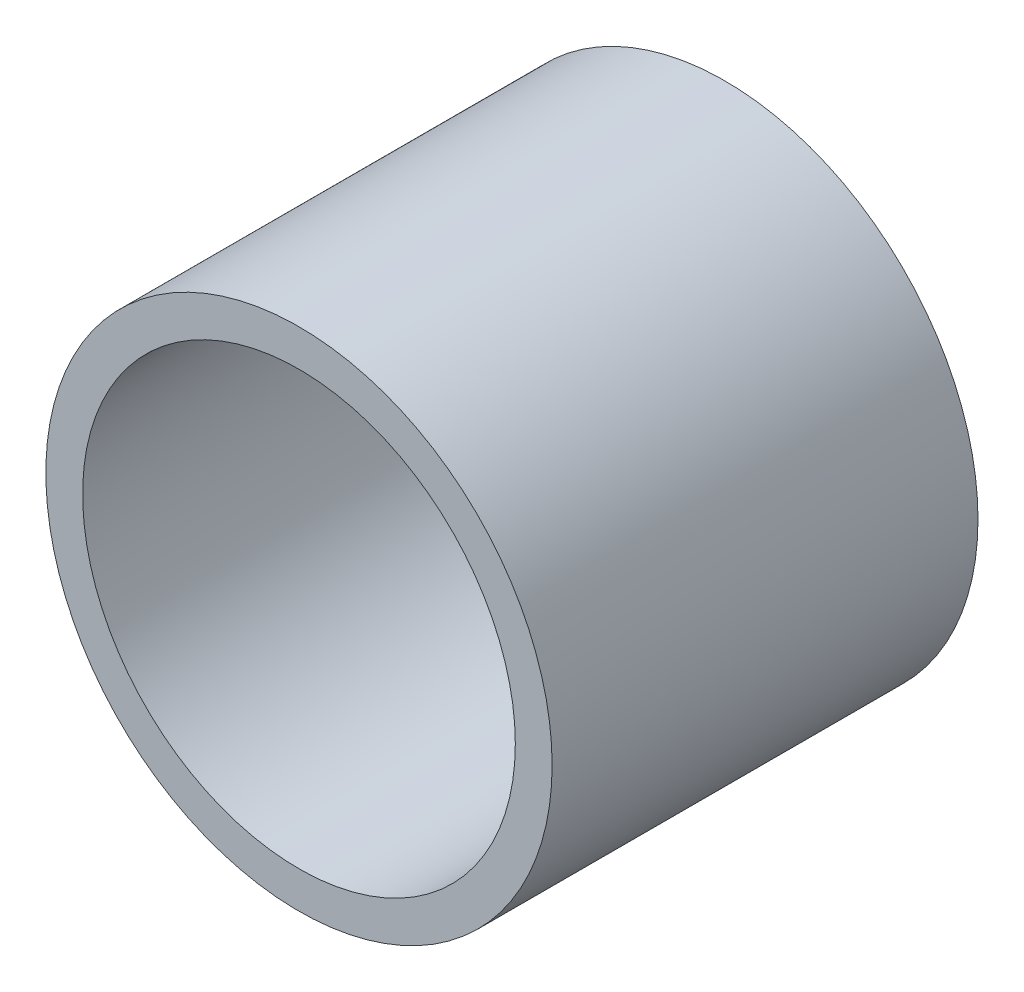
ISO-10303-21;
HEADER;
FILE_DESCRIPTION(('STEP AP214'),'2;1');
FILE_NAME('part.step','',(''),(''),'','','');
FILE_SCHEMA(('AUTOMOTIVE_DESIGN { 1 0 10303 214 1 1 1 1 }'));
ENDSEC;
DATA;
#1=APPLICATION_CONTEXT('core data for automotive mechanical design processes');
#2=APPLICATION_PROTOCOL_DEFINITION('international standard','automotive_design',2000,#1);
#3=PRODUCT_CONTEXT('',#1,'mechanical');
#4=PRODUCT('Part','Part','',(#3));
#5=PRODUCT_RELATED_PRODUCT_CATEGORY('part','',(#4));
#6=PRODUCT_DEFINITION_FORMATION('','',#4);
#7=PRODUCT_DEFINITION_CONTEXT('part definition',#1,'design');
#8=PRODUCT_DEFINITION('design','',#6,#7);
#9=PRODUCT_DEFINITION_SHAPE('','',#8);
#10=(LENGTH_UNIT() NAMED_UNIT(*) SI_UNIT(.MILLI.,.METRE.));
#11=(NAMED_UNIT(*) PLANE_ANGLE_UNIT() SI_UNIT($,.RADIAN.));
#12=(NAMED_UNIT(*) SI_UNIT($,.STERADIAN.) SOLID_ANGLE_UNIT());
#13=UNCERTAINTY_MEASURE_WITH_UNIT(LENGTH_MEASURE(1.E-05),#10,'distance_accuracy_value','');
#14=(GEOMETRIC_REPRESENTATION_CONTEXT(3) GLOBAL_UNCERTAINTY_ASSIGNED_CONTEXT((#13)) GLOBAL_UNIT_ASSIGNED_CONTEXT((#10,
#11,#12)) REPRESENTATION_CONTEXT('',''));
#15=CARTESIAN_POINT('',(0.,0.,0.));
#16=DIRECTION('',(0.,0.,1.));
#17=DIRECTION('',(1.,0.,0.));
#18=AXIS2_PLACEMENT_3D('',#15,#16,#17);
#19=CARTESIAN_POINT('',(0.,0.,50.));
#20=DIRECTION('',(0.,0.,1.));
#21=DIRECTION('',(1.,0.,0.));
#22=AXIS2_PLACEMENT_3D('',#19,#20,#21);
#23=PLANE('',#22);
#24=CARTESIAN_POINT('',(0.,0.,50.));
#25=DIRECTION('',(0.,0.,1.));
#26=DIRECTION('',(1.,0.,0.));
#27=AXIS2_PLACEMENT_3D('',#24,#25,#26);
#28=CIRCLE('',#27,29.72);
#29=CARTESIAN_POINT('',(29.72,0.,50.));
#30=VERTEX_POINT('',#29);
#31=EDGE_CURVE('E10',#30,#30,#28,.T.);
#32=ORIENTED_EDGE('',*,*,#31,.T.);
#33=EDGE_LOOP('',(#32));
#34=FACE_BOUND('',#33,.T.);
#35=CARTESIAN_POINT('',(0.,0.,50.));
#36=DIRECTION('',(0.,0.,1.));
#37=DIRECTION('',(1.,0.,0.));
#38=AXIS2_PLACEMENT_3D('',#35,#36,#37);
#39=CIRCLE('',#38,25.4);
#40=CARTESIAN_POINT('',(25.4,0.,50.));
#41=VERTEX_POINT('',#40);
#42=EDGE_CURVE('E48',#41,#41,#39,.T.);
#43=ORIENTED_EDGE('',*,*,#42,.F.);
#44=EDGE_LOOP('',(#43));
#45=FACE_BOUND('',#44,.T.);
#46=ADVANCED_FACE('F37',(#34,#45),#23,.T.);
#47=CARTESIAN_POINT('',(0.,0.,0.));
#48=DIRECTION('',(0.,0.,1.));
#49=DIRECTION('',(1.,0.,0.));
#50=AXIS2_PLACEMENT_3D('',#47,#48,#49);
#51=PLANE('',#50);
#52=CARTESIAN_POINT('',(0.,0.,0.));
#53=DIRECTION('',(0.,0.,1.));
#54=DIRECTION('',(1.,0.,0.));
#55=AXIS2_PLACEMENT_3D('',#52,#53,#54);
#56=CIRCLE('',#55,29.72);
#57=CARTESIAN_POINT('',(29.72,0.,0.));
#58=VERTEX_POINT('',#57);
#59=EDGE_CURVE('E41',#58,#58,#56,.T.);
#60=ORIENTED_EDGE('',*,*,#59,.F.);
#61=EDGE_LOOP('',(#60));
#62=FACE_BOUND('',#61,.T.);
#63=CARTESIAN_POINT('',(0.,0.,0.));
#64=DIRECTION('',(0.,0.,1.));
#65=DIRECTION('',(1.,0.,0.));
#66=AXIS2_PLACEMENT_3D('',#63,#64,#65);
#67=CIRCLE('',#66,25.4);
#68=CARTESIAN_POINT('',(25.4,0.,0.));
#69=VERTEX_POINT('',#68);
#70=EDGE_CURVE('E50',#69,#69,#67,.T.);
#71=ORIENTED_EDGE('',*,*,#70,.T.);
#72=EDGE_LOOP('',(#71));
#73=FACE_BOUND('',#72,.T.);
#74=ADVANCED_FACE('F60',(#62,#73),#51,.F.);
#75=CARTESIAN_POINT('',(0.,0.,50.));
#76=DIRECTION('',(0.,0.,-1.));
#77=DIRECTION('',(-1.,0.,0.));
#78=AXIS2_PLACEMENT_3D('',#75,#76,#77);
#79=CYLINDRICAL_SURFACE('',#78,29.72);
#80=ORIENTED_EDGE('',*,*,#31,.F.);
#81=EDGE_LOOP('',(#80));
#82=FACE_BOUND('',#81,.T.);
#83=ORIENTED_EDGE('',*,*,#59,.T.);
#84=EDGE_LOOP('',(#83));
#85=FACE_BOUND('',#84,.T.);
#86=ADVANCED_FACE('F39',(#82,#85),#79,.T.);
#87=CARTESIAN_POINT('',(0.,0.,50.));
#88=DIRECTION('',(0.,0.,-1.));
#89=DIRECTION('',(-1.,0.,0.));
#90=AXIS2_PLACEMENT_3D('',#87,#88,#89);
#91=CYLINDRICAL_SURFACE('',#90,25.4);
#92=ORIENTED_EDGE('',*,*,#42,.T.);
#93=EDGE_LOOP('',(#92));
#94=FACE_BOUND('',#93,.T.);
#95=ORIENTED_EDGE('',*,*,#70,.F.);
#96=EDGE_LOOP('',(#95));
#97=FACE_BOUND('',#96,.T.);
#98=ADVANCED_FACE('F56',(#94,#97),#91,.F.);
#99=CLOSED_SHELL('',(#46,#74,#86,#98));
#100=MANIFOLD_SOLID_BREP('B2',#99);
#101=ADVANCED_BREP_SHAPE_REPRESENTATION('',(#18,#100),#14);
#102=SHAPE_DEFINITION_REPRESENTATION(#9,#101);
ENDSEC;
END-ISO-10303-21;
